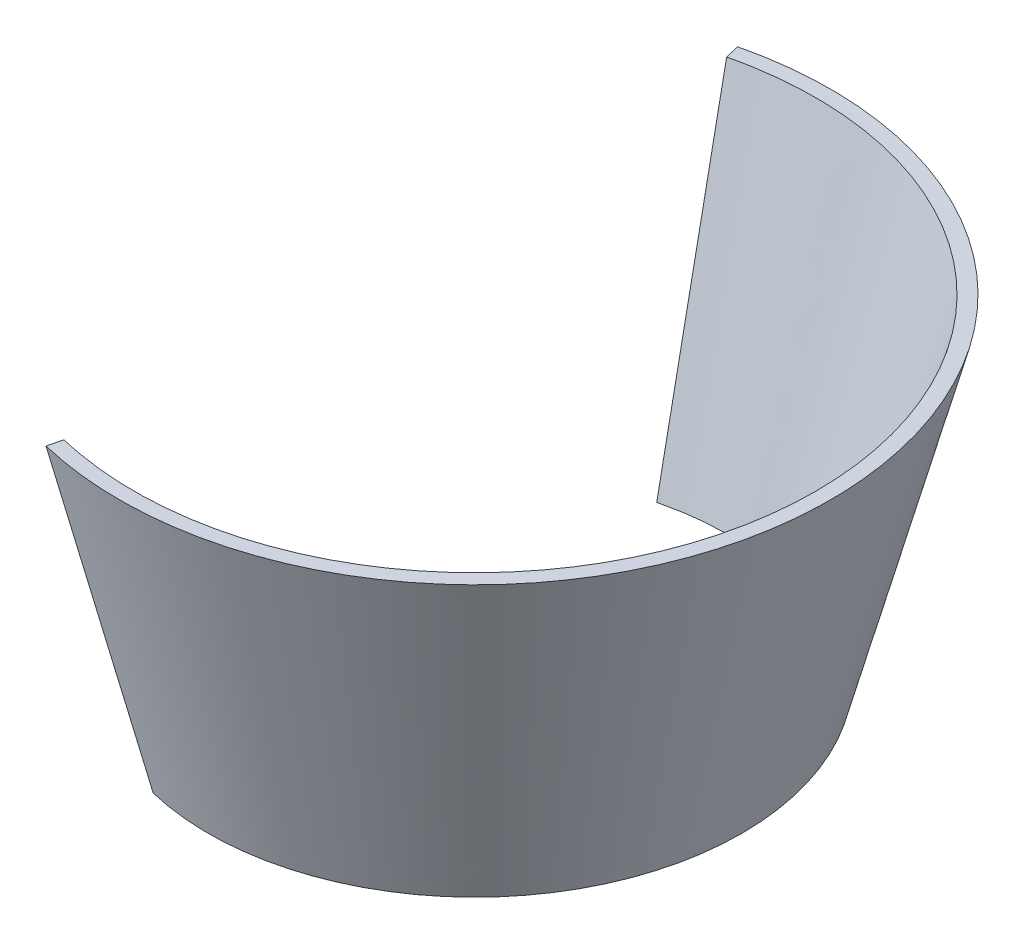
ISO-10303-21;
HEADER;
FILE_DESCRIPTION(('STEP AP214'),'2;1');
FILE_NAME('part.step','',(''),(''),'','','');
FILE_SCHEMA(('AUTOMOTIVE_DESIGN { 1 0 10303 214 1 1 1 1 }'));
ENDSEC;
DATA;
#1=APPLICATION_CONTEXT('core data for automotive mechanical design processes');
#2=APPLICATION_PROTOCOL_DEFINITION('international standard','automotive_design',2000,#1);
#3=PRODUCT_CONTEXT('',#1,'mechanical');
#4=PRODUCT('Part','Part','',(#3));
#5=PRODUCT_RELATED_PRODUCT_CATEGORY('part','',(#4));
#6=PRODUCT_DEFINITION_FORMATION('','',#4);
#7=PRODUCT_DEFINITION_CONTEXT('part definition',#1,'design');
#8=PRODUCT_DEFINITION('design','',#6,#7);
#9=PRODUCT_DEFINITION_SHAPE('','',#8);
#10=(LENGTH_UNIT() NAMED_UNIT(*) SI_UNIT(.MILLI.,.METRE.));
#11=(NAMED_UNIT(*) PLANE_ANGLE_UNIT() SI_UNIT($,.RADIAN.));
#12=(NAMED_UNIT(*) SI_UNIT($,.STERADIAN.) SOLID_ANGLE_UNIT());
#13=UNCERTAINTY_MEASURE_WITH_UNIT(LENGTH_MEASURE(1.E-05),#10,'distance_accuracy_value','');
#14=(GEOMETRIC_REPRESENTATION_CONTEXT(3) GLOBAL_UNCERTAINTY_ASSIGNED_CONTEXT((#13)) GLOBAL_UNIT_ASSIGNED_CONTEXT((#10,
#11,#12)) REPRESENTATION_CONTEXT('',''));
#15=CARTESIAN_POINT('',(0.,0.,0.));
#16=DIRECTION('',(0.,0.,1.));
#17=DIRECTION('',(1.,0.,0.));
#18=AXIS2_PLACEMENT_3D('',#15,#16,#17);
#19=CARTESIAN_POINT('',(26.2130748865882,45.,0.));
#20=DIRECTION('',(0.,1.,0.));
#21=DIRECTION('',(0.,0.,1.));
#22=AXIS2_PLACEMENT_3D('',#19,#20,#21);
#23=PLANE('',#22);
#24=CARTESIAN_POINT('',(26.2130748865882,45.,0.));
#25=DIRECTION('',(0.,1.,0.));
#26=DIRECTION('',(0.,0.,1.));
#27=AXIS2_PLACEMENT_3D('',#24,#25,#26);
#28=CIRCLE('',#27,48.);
#29=CARTESIAN_POINT('',(14.978208522353,45.,46.6666666666667));
#30=VERTEX_POINT('',#29);
#31=CARTESIAN_POINT('',(14.9782085223531,45.,-46.6666666666667));
#32=VERTEX_POINT('',#31);
#33=EDGE_CURVE('E307',#30,#32,#28,.T.);
#34=ORIENTED_EDGE('',*,*,#33,.T.);
#35=DIRECTION('',(0.234059715921564,0.,0.972222222222223));
#36=VECTOR('',#35,1.);
#37=CARTESIAN_POINT('',(15.4463279541962,45.,-44.7222222222222));
#38=LINE('',#37,#36);
#39=CARTESIAN_POINT('',(15.4463279541962,45.,-44.7222222222222));
#40=VERTEX_POINT('',#39);
#41=EDGE_CURVE('E345',#32,#40,#38,.T.);
#42=ORIENTED_EDGE('',*,*,#41,.T.);
#43=CARTESIAN_POINT('',(26.2130748865882,45.,0.));
#44=DIRECTION('',(0.,-1.,0.));
#45=DIRECTION('',(0.,0.,1.));
#46=AXIS2_PLACEMENT_3D('',#43,#44,#45);
#47=CIRCLE('',#46,46.);
#48=CARTESIAN_POINT('',(15.4463279541962,45.,44.7222222222222));
#49=VERTEX_POINT('',#48);
#50=EDGE_CURVE('E161',#40,#49,#47,.T.);
#51=ORIENTED_EDGE('',*,*,#50,.T.);
#52=DIRECTION('',(-0.234059715921565,0.,0.972222222222222));
#53=VECTOR('',#52,1.);
#54=CARTESIAN_POINT('',(14.978208522353,45.,46.6666666666667));
#55=LINE('',#54,#53);
#56=EDGE_CURVE('E13',#49,#30,#55,.T.);
#57=ORIENTED_EDGE('',*,*,#56,.T.);
#58=EDGE_LOOP('',(#34,#42,#51,#57));
#59=FACE_BOUND('',#58,.T.);
#60=ADVANCED_FACE('F151',(#59),#23,.T.);
#61=CARTESIAN_POINT('',(26.2130748865882,0.,0.));
#62=DIRECTION('',(0.,1.,0.));
#63=DIRECTION('',(0.,0.,1.));
#64=AXIS2_PLACEMENT_3D('',#61,#62,#63);
#65=PLANE('',#64);
#66=CARTESIAN_POINT('',(26.2130748865882,0.,0.));
#67=DIRECTION('',(0.,1.,0.));
#68=DIRECTION('',(0.,0.,1.));
#69=AXIS2_PLACEMENT_3D('',#66,#67,#68);
#70=CIRCLE('',#69,36.);
#71=CARTESIAN_POINT('',(17.7869251134118,0.,35.));
#72=VERTEX_POINT('',#71);
#73=CARTESIAN_POINT('',(17.7869251134118,0.,-35.));
#74=VERTEX_POINT('',#73);
#75=EDGE_CURVE('E226',#72,#74,#70,.T.);
#76=ORIENTED_EDGE('',*,*,#75,.F.);
#77=DIRECTION('',(0.,0.,1.));
#78=VECTOR('',#77,1.);
#79=CARTESIAN_POINT('',(17.7869251134118,0.,35.));
#80=LINE('',#79,#78);
#81=CARTESIAN_POINT('',(17.7869251134118,0.,32.9428571428571));
#82=VERTEX_POINT('',#81);
#83=EDGE_CURVE('E232',#82,#72,#80,.T.);
#84=ORIENTED_EDGE('',*,*,#83,.F.);
#85=DIRECTION('',(-0.972222222222222,0.,-0.234059715921569));
#86=VECTOR('',#85,1.);
#87=CARTESIAN_POINT('',(18.255044545255,0.,33.0555555555556));
#88=LINE('',#87,#86);
#89=CARTESIAN_POINT('',(18.2550445452549,0.,33.0555555555556));
#90=VERTEX_POINT('',#89);
#91=EDGE_CURVE('E237',#90,#82,#88,.T.);
#92=ORIENTED_EDGE('',*,*,#91,.F.);
#93=CARTESIAN_POINT('',(26.2130748865882,0.,0.));
#94=DIRECTION('',(0.,-1.,0.));
#95=DIRECTION('',(0.,0.,1.));
#96=AXIS2_PLACEMENT_3D('',#93,#94,#95);
#97=CIRCLE('',#96,34.);
#98=CARTESIAN_POINT('',(18.255044545255,0.,-33.0555555555556));
#99=VERTEX_POINT('',#98);
#100=EDGE_CURVE('E210',#99,#90,#97,.T.);
#101=ORIENTED_EDGE('',*,*,#100,.F.);
#102=DIRECTION('',(0.972222222222226,0.,-0.234059715921549));
#103=VECTOR('',#102,1.);
#104=CARTESIAN_POINT('',(18.255044545255,0.,-33.0555555555556));
#105=LINE('',#104,#103);
#106=CARTESIAN_POINT('',(17.7869251134118,0.,-32.9428571428572));
#107=VERTEX_POINT('',#106);
#108=EDGE_CURVE('E201',#107,#99,#105,.T.);
#109=ORIENTED_EDGE('',*,*,#108,.F.);
#110=DIRECTION('',(0.,0.,1.));
#111=VECTOR('',#110,1.);
#112=CARTESIAN_POINT('',(17.7869251134118,0.,-32.9428571428572));
#113=LINE('',#112,#111);
#114=EDGE_CURVE('E206',#74,#107,#113,.T.);
#115=ORIENTED_EDGE('',*,*,#114,.F.);
#116=EDGE_LOOP('',(#76,#84,#92,#101,#109,#115));
#117=FACE_BOUND('',#116,.T.);
#118=ADVANCED_FACE('F205',(#117),#65,.F.);
#119=CARTESIAN_POINT('',(17.7869251134118,0.,35.));
#120=CARTESIAN_POINT('',(16.8506862497255,15.,38.8888888888889));
#121=CARTESIAN_POINT('',(15.9144473860393,30.,42.7777777777778));
#122=CARTESIAN_POINT('',(14.978208522353,45.,46.6666666666667));
#123=CARTESIAN_POINT('',(20.4331930740949,0.,35.6370814336193));
#124=CARTESIAN_POINT('',(19.7812200443416,15.,39.5944065079972));
#125=CARTESIAN_POINT('',(19.1292470145884,30.,43.5517315823751));
#126=CARTESIAN_POINT('',(18.4772739848351,45.,47.509056656753));
#127=CARTESIAN_POINT('',(25.8650341850031,0.,36.3073434104184));
#128=CARTESIAN_POINT('',(25.8009951086674,15.,40.3400230841756));
#129=CARTESIAN_POINT('',(25.7369560323318,30.,44.3727027579328));
#130=CARTESIAN_POINT('',(25.6729169559961,44.9999999999999,48.40538243169));
#131=CARTESIAN_POINT('',(34.0166451466117,0.,35.4594510222689));
#132=CARTESIAN_POINT('',(34.8486569384541,15.0000000000001,39.4066620473167));
#133=CARTESIAN_POINT('',(35.6806687302965,30.0000000000001,43.3538730723645));
#134=CARTESIAN_POINT('',(36.512680522139,45.0000000000002,47.3010840974123));
#135=CARTESIAN_POINT('',(41.7607016913342,0.,32.8099715229774));
#136=CARTESIAN_POINT('',(43.4550868743957,14.9999999999999,36.4714187426141));
#137=CARTESIAN_POINT('',(45.1494720574571,29.9999999999999,40.1328659622508));
#138=CARTESIAN_POINT('',(46.8438572405185,44.9999999999998,43.7943131818875));
#139=CARTESIAN_POINT('',(48.7087108034478,0.,28.4979865766534));
#140=CARTESIAN_POINT('',(51.1842284172741,15.0000000000001,31.6841146788741));
#141=CARTESIAN_POINT('',(53.6597460311003,30.0000000000001,34.8702427810947));
#142=CARTESIAN_POINT('',(56.1352636449266,45.0000000000002,38.0563708833153));
#143=CARTESIAN_POINT('',(54.5130134713977,0.,22.7440124593599));
#144=CARTESIAN_POINT('',(57.6445749314993,15.,25.28838815786));
#145=CARTESIAN_POINT('',(60.7761363916009,29.9999999999999,27.8327638563602));
#146=CARTESIAN_POINT('',(63.9076978517024,44.9999999999999,30.3771395548604));
#147=CARTESIAN_POINT('',(58.8828519067817,0.,15.8386051696977));
#148=CARTESIAN_POINT('',(62.5086688342452,15.,17.6087417962542));
#149=CARTESIAN_POINT('',(66.1344857617086,30.,19.3788784228106));
#150=CARTESIAN_POINT('',(69.760302689172,45.,21.1490150493671));
#151=CARTESIAN_POINT('',(61.5984915351359,0.,8.12875589718416));
#152=CARTESIAN_POINT('',(65.5301458182768,15.,9.03450084914826));
#153=CARTESIAN_POINT('',(69.4618001014176,30.,9.94024580111236));
#154=CARTESIAN_POINT('',(73.3934543845585,45.,10.8459907530765));
#155=CARTESIAN_POINT('',(62.2130748865882,0.,2.71057142539832));
#156=CARTESIAN_POINT('',(66.2130748865882,15.,3.01174602822036));
#157=CARTESIAN_POINT('',(70.2130748865882,30.,3.31292063104239));
#158=CARTESIAN_POINT('',(74.2130748865882,45.,3.61409523386442));
#159=CARTESIAN_POINT('',(62.2130748865882,0.,-2.71057142539832));
#160=CARTESIAN_POINT('',(66.2130748865882,15.,-3.01174602822035));
#161=CARTESIAN_POINT('',(70.2130748865882,30.,-3.31292063104238));
#162=CARTESIAN_POINT('',(74.2130748865882,45.,-3.61409523386442));
#163=CARTESIAN_POINT('',(61.5984915351359,0.,-8.12875589718417));
#164=CARTESIAN_POINT('',(65.5301458182768,15.,-9.03450084914827));
#165=CARTESIAN_POINT('',(69.4618001014176,30.,-9.94024580111237));
#166=CARTESIAN_POINT('',(73.3934543845585,45.0000000000001,-10.8459907530765));
#167=CARTESIAN_POINT('',(58.8828519067818,0.,-15.8386051696977));
#168=CARTESIAN_POINT('',(62.5086688342452,15.,-17.6087417962542));
#169=CARTESIAN_POINT('',(66.1344857617086,30.,-19.3788784228107));
#170=CARTESIAN_POINT('',(69.760302689172,45.,-21.1490150493671));
#171=CARTESIAN_POINT('',(54.5130134713977,0.,-22.7440124593598));
#172=CARTESIAN_POINT('',(57.6445749314993,15.,-25.28838815786));
#173=CARTESIAN_POINT('',(60.7761363916009,30.,-27.8327638563602));
#174=CARTESIAN_POINT('',(63.9076978517024,45.,-30.3771395548604));
#175=CARTESIAN_POINT('',(48.7087108034481,0.,-28.4979865766535));
#176=CARTESIAN_POINT('',(51.1842284172742,15.,-31.6841146788741));
#177=CARTESIAN_POINT('',(53.6597460311004,29.9999999999999,-34.8702427810947));
#178=CARTESIAN_POINT('',(56.1352636449266,44.9999999999999,-38.0563708833153));
#179=CARTESIAN_POINT('',(41.7607016913339,0.,-32.8099715229774));
#180=CARTESIAN_POINT('',(43.4550868743954,15.0000000000001,-36.4714187426141));
#181=CARTESIAN_POINT('',(45.1494720574569,30.0000000000001,-40.1328659622508));
#182=CARTESIAN_POINT('',(46.8438572405184,45.0000000000002,-43.7943131818875));
#183=CARTESIAN_POINT('',(34.016645146612,0.,-35.4594510222689));
#184=CARTESIAN_POINT('',(34.8486569384544,14.9999999999999,-39.4066620473167));
#185=CARTESIAN_POINT('',(35.6806687302968,29.9999999999999,-43.3538730723645));
#186=CARTESIAN_POINT('',(36.5126805221392,44.9999999999998,-47.3010840974123));
#187=CARTESIAN_POINT('',(25.865034185003,0.,-36.3073434104184));
#188=CARTESIAN_POINT('',(25.8009951086673,15.,-40.3400230841756));
#189=CARTESIAN_POINT('',(25.7369560323317,30.,-44.3727027579328));
#190=CARTESIAN_POINT('',(25.672916955996,45.0000000000001,-48.40538243169));
#191=CARTESIAN_POINT('',(20.4331930740949,0.,-35.6370814336193));
#192=CARTESIAN_POINT('',(19.7812200443417,15.,-39.5944065079972));
#193=CARTESIAN_POINT('',(19.1292470145884,30.,-43.5517315823751));
#194=CARTESIAN_POINT('',(18.4772739848351,45.,-47.509056656753));
#195=CARTESIAN_POINT('',(17.7869251134118,0.,-35.));
#196=CARTESIAN_POINT('',(16.8506862497256,15.,-38.8888888888889));
#197=CARTESIAN_POINT('',(15.9144473860393,30.,-42.7777777777778));
#198=CARTESIAN_POINT('',(14.9782085223531,45.,-46.6666666666667));
#199=B_SPLINE_SURFACE_WITH_KNOTS('',3,3,((#119,#120,#121,#122),(#123,#124,#125,#126),(#127,#128,
#129,#130),(#131,#132,#133,#134),(#135,#136,#137,#138),(#139,#140,#141,#142),(#143,#144,#145,
#146),(#147,#148,#149,#150),(#151,#152,#153,#154),(#155,#156,#157,#158),(#159,#160,#161,#162),
(#163,#164,#165,#166),(#167,#168,#169,#170),(#171,#172,#173,#174),(#175,#176,#177,#178),(#179,
#180,#181,#182),(#183,#184,#185,#186),(#187,#188,#189,#190),(#191,#192,#193,#194),(#195,#196,
#197,#198)),.UNSPECIFIED.,.F.,.F.,.F.,(4,1,1,1,1,1,1,1,2,1,1,1,1,1,1,1,4),(4,4),
(0.49556834923423,0.52709532740709,0.558622305579951,0.590149283752812,0.621676261925672,
0.653203240098533,0.684730218271394,0.716257196444254,0.747784174617115,0.779311152789976,
0.810838130962836,0.842365109135697,0.873892087308557,0.905419065481418,0.936946043654279,
0.968473021827139,1.),(0.,1.),.UNSPECIFIED.);
#200=CARTESIAN_POINT('',(17.7869251134118,0.,-35.));
#201=CARTESIAN_POINT('',(16.8506862497256,15.,-38.8888888888889));
#202=CARTESIAN_POINT('',(15.9144473860393,30.,-42.7777777777778));
#203=CARTESIAN_POINT('',(14.9782085223531,45.,-46.6666666666667));
#204=B_SPLINE_CURVE_WITH_KNOTS('',3,(#200,#201,#202,#203),.UNSPECIFIED.,.F.,.F.,(4,4),(0.,1.),.UNSPECIFIED.);
#205=EDGE_CURVE('E225',#74,#32,#204,.T.);
#206=CARTESIAN_POINT('',(17.7869251134118,0.,35.));
#207=CARTESIAN_POINT('',(16.8506862497255,15.,38.8888888888889));
#208=CARTESIAN_POINT('',(15.9144473860393,30.,42.7777777777778));
#209=CARTESIAN_POINT('',(14.978208522353,45.,46.6666666666667));
#210=B_SPLINE_CURVE_WITH_KNOTS('',3,(#206,#207,#208,#209),.UNSPECIFIED.,.F.,.F.,(4,4),(0.,1.),.UNSPECIFIED.);
#211=EDGE_CURVE('E234',#72,#30,#210,.T.);
#212=ORIENTED_EDGE('',*,*,#75,.T.);
#213=ORIENTED_EDGE('',*,*,#205,.T.);
#214=ORIENTED_EDGE('',*,*,#33,.F.);
#215=ORIENTED_EDGE('',*,*,#211,.F.);
#216=EDGE_LOOP('',(#212,#213,#214,#215));
#217=FACE_BOUND('',#216,.T.);
#218=ADVANCED_FACE('F312',(#217),#199,.T.);
#219=CARTESIAN_POINT('',(17.7869251134118,0.,32.9428571428571));
#220=CARTESIAN_POINT('',(17.0067260603399,15.,36.8693121693122));
#221=CARTESIAN_POINT('',(16.226527007268,30.,40.7957671957672));
#222=CARTESIAN_POINT('',(15.4463279541962,45.,44.7222222222222));
#223=CARTESIAN_POINT('',(17.7869251134118,0.,33.1142857142857));
#224=CARTESIAN_POINT('',(16.9937227427887,15.,37.0376102292769));
#225=CARTESIAN_POINT('',(16.2005203721657,30.,40.9609347442681));
#226=CARTESIAN_POINT('',(15.4073180015426,45.,44.8842592592593));
#227=CARTESIAN_POINT('',(17.7869251134118,0.,33.4571428571429));
#228=CARTESIAN_POINT('',(16.9677161076864,15.,37.3742063492064));
#229=CARTESIAN_POINT('',(16.1485071019609,30.0000000000001,41.2912698412699));
#230=CARTESIAN_POINT('',(15.3292980962354,45.0000000000001,45.2083333333334));
#231=CARTESIAN_POINT('',(17.7869251134118,0.,33.9714285714285));
#232=CARTESIAN_POINT('',(16.9287061550327,15.,37.8791005291005));
#233=CARTESIAN_POINT('',(16.0704871966536,29.9999999999999,41.7867724867724));
#234=CARTESIAN_POINT('',(15.2122682382746,44.9999999999999,45.6944444444444));
#235=CARTESIAN_POINT('',(17.7869251134118,0.,34.4857142857143));
#236=CARTESIAN_POINT('',(16.8896962023792,15.,38.3839947089947));
#237=CARTESIAN_POINT('',(15.9924672913465,30.,42.2822751322751));
#238=CARTESIAN_POINT('',(15.0952383803138,45.0000000000001,46.1805555555556));
#239=CARTESIAN_POINT('',(17.7869251134118,0.,34.8285714285714));
#240=CARTESIAN_POINT('',(16.8636895672768,15.,38.7205908289242));
#241=CARTESIAN_POINT('',(15.9404540211417,30.,42.6126102292769));
#242=CARTESIAN_POINT('',(15.0172184750066,45.,46.5046296296296));
#243=CARTESIAN_POINT('',(17.7869251134118,0.,35.));
#244=CARTESIAN_POINT('',(16.8506862497255,15.,38.8888888888889));
#245=CARTESIAN_POINT('',(15.9144473860393,30.,42.7777777777778));
#246=CARTESIAN_POINT('',(14.978208522353,45.,46.6666666666667));
#247=B_SPLINE_SURFACE_WITH_KNOTS('',3,3,((#219,#220,#221,#222),(#223,#224,#225,#226),(#227,#228,
#229,#230),(#231,#232,#233,#234),(#235,#236,#237,#238),(#239,#240,#241,#242),(#243,#244,#245,
#246)),.UNSPECIFIED.,.F.,.F.,.F.,(4,1,1,1,4),(4,4),(0.488673323218464,0.490397079722405,
0.492120836226347,0.493844592730288,0.49556834923423),(0.,1.),.UNSPECIFIED.);
#248=CARTESIAN_POINT('',(17.7869251134118,0.,32.9428571428571));
#249=CARTESIAN_POINT('',(17.0067260603399,15.,36.8693121693122));
#250=CARTESIAN_POINT('',(16.226527007268,30.,40.7957671957672));
#251=CARTESIAN_POINT('',(15.4463279541962,45.,44.7222222222222));
#252=B_SPLINE_CURVE_WITH_KNOTS('',3,(#248,#249,#250,#251),.UNSPECIFIED.,.F.,.F.,(4,4),(0.,1.),.UNSPECIFIED.);
#253=EDGE_CURVE('E169',#82,#49,#252,.T.);
#254=ORIENTED_EDGE('',*,*,#83,.T.);
#255=ORIENTED_EDGE('',*,*,#211,.T.);
#256=ORIENTED_EDGE('',*,*,#56,.F.);
#257=ORIENTED_EDGE('',*,*,#253,.F.);
#258=EDGE_LOOP('',(#254,#255,#256,#257));
#259=FACE_BOUND('',#258,.T.);
#260=ADVANCED_FACE('F265',(#259),#247,.T.);
#261=CARTESIAN_POINT('',(17.7869251134118,0.,-32.9428571428571));
#262=CARTESIAN_POINT('',(17.00672606034,15.,-36.8693121693122));
#263=CARTESIAN_POINT('',(16.2265270072681,30.,-40.7957671957672));
#264=CARTESIAN_POINT('',(15.4463279541962,45.,-44.7222222222222));
#265=CARTESIAN_POINT('',(17.844321171125,0.,-32.9566750793909));
#266=CARTESIAN_POINT('',(17.0690567890316,15.,-36.884318113753));
#267=CARTESIAN_POINT('',(16.2937924069383,30.,-40.811961148115));
#268=CARTESIAN_POINT('',(15.518528024845,45.,-44.7396041824771));
#269=CARTESIAN_POINT('',(17.9191392160667,0.,-32.9746873094599));
#270=CARTESIAN_POINT('',(17.172965257726,15.,-36.9092313949099));
#271=CARTESIAN_POINT('',(16.4267912993854,30.,-40.84377548036));
#272=CARTESIAN_POINT('',(15.6806173410448,45.,-44.77831956581));
#273=CARTESIAN_POINT('',(18.0222286622794,0.,-32.9995057984262));
#274=CARTESIAN_POINT('',(17.354352288882,15.,-36.9518879632082));
#275=CARTESIAN_POINT('',(16.6864759154846,30.,-40.9042701279902));
#276=CARTESIAN_POINT('',(16.0185995420871,44.9999999999999,-44.8566522927722));
#277=CARTESIAN_POINT('',(18.1244507290917,0.,-33.0241154682858));
#278=CARTESIAN_POINT('',(17.5383816825623,15.,-36.9941106613306));
#279=CARTESIAN_POINT('',(16.9523126360328,30.0000000000001,-40.9641058543753));
#280=CARTESIAN_POINT('',(16.3662435895034,45.0000000000001,-44.9341010474201));
#281=CARTESIAN_POINT('',(18.1993695345363,0.,-33.0421519561573));
#282=CARTESIAN_POINT('',(17.6446326942419,15.,-37.0182603540947));
#283=CARTESIAN_POINT('',(17.0898958539475,30.,-40.994368752032));
#284=CARTESIAN_POINT('',(16.5351590136531,45.,-44.9704771499694));
#285=CARTESIAN_POINT('',(20.7397517410092,0.,-33.6537416976674));
#286=CARTESIAN_POINT('',(20.4779141773658,15.,-37.6692701194291));
#287=CARTESIAN_POINT('',(20.2160766137224,30.,-41.6847985411908));
#288=CARTESIAN_POINT('',(19.9542390500789,45.,-45.7003269629526));
#289=CARTESIAN_POINT('',(25.8461204162653,0.,-34.2879404256693));
#290=CARTESIAN_POINT('',(26.1640951728946,15.,-38.3182863247147));
#291=CARTESIAN_POINT('',(26.4820699295239,30.,-42.34863222376));
#292=CARTESIAN_POINT('',(26.8000446861533,45.,-46.3789781228053));
#293=CARTESIAN_POINT('',(33.528669537866,0.,-33.5006794673219));
#294=CARTESIAN_POINT('',(34.6971993045908,15.,-37.3678349201799));
#295=CARTESIAN_POINT('',(35.8657290713155,30.,-41.2349903730378));
#296=CARTESIAN_POINT('',(37.0342588380403,45.,-45.1021458258958));
#297=CARTESIAN_POINT('',(40.8435107249492,0.,-31.0126220206275));
#298=CARTESIAN_POINT('',(42.8052842513913,15.,-34.5410342906244));
#299=CARTESIAN_POINT('',(44.7670577778335,30.,-38.0694465606213));
#300=CARTESIAN_POINT('',(46.7288313042757,45.0000000000001,-41.5978588306182));
#301=CARTESIAN_POINT('',(47.4180488604718,0.,-26.9480088120864));
#302=CARTESIAN_POINT('',(50.0809757610789,15.,-29.9791035260715));
#303=CARTESIAN_POINT('',(52.7439026616859,30.,-33.0101982400566));
#304=CARTESIAN_POINT('',(55.406829562293,44.9999999999999,-36.0412929540417));
#305=CARTESIAN_POINT('',(52.9166824036968,0.,-21.5121862884483));
#306=CARTESIAN_POINT('',(56.1583902532594,15.,-23.9109652714076));
#307=CARTESIAN_POINT('',(59.4000981028219,30.,-26.3097442543669));
#308=CARTESIAN_POINT('',(62.6418059523845,45.,-28.7085232373263));
#309=CARTESIAN_POINT('',(57.0584767307628,0.,-14.9808894337757));
#310=CARTESIAN_POINT('',(60.7319252252126,15.,-16.6412203255765));
#311=CARTESIAN_POINT('',(64.4053737196625,30.,-18.3015512173773));
#312=CARTESIAN_POINT('',(68.0788222141123,45.0000000000001,-19.9618821091782));
#313=CARTESIAN_POINT('',(59.6314598983773,0.,-7.68633689094628));
#314=CARTESIAN_POINT('',(63.5714220086092,15.,-8.53512477693396));
#315=CARTESIAN_POINT('',(67.5113841188411,29.9999999999999,-9.38391266292164));
#316=CARTESIAN_POINT('',(71.451346229073,44.9999999999999,-10.2327005489093));
#317=CARTESIAN_POINT('',(60.5040624137008,0.,0.));
#318=CARTESIAN_POINT('',(64.5340993544708,15.0000000000001,0.));
#319=CARTESIAN_POINT('',(68.5641362952409,30.0000000000001,0.));
#320=CARTESIAN_POINT('',(72.5941732360109,45.0000000000002,0.));
#321=CARTESIAN_POINT('',(59.6314598983773,0.,7.68633689094624));
#322=CARTESIAN_POINT('',(63.5714220086093,14.9999999999999,8.53512477693395));
#323=CARTESIAN_POINT('',(67.5113841188413,29.9999999999999,9.38391266292165));
#324=CARTESIAN_POINT('',(71.4513462290733,44.9999999999998,10.2327005489094));
#325=CARTESIAN_POINT('',(57.0584767307627,0.,14.9808894337756));
#326=CARTESIAN_POINT('',(60.7319252252124,15.0000000000001,16.6412203255765));
#327=CARTESIAN_POINT('',(64.4053737196621,30.0000000000001,18.3015512173774));
#328=CARTESIAN_POINT('',(68.0788222141117,45.0000000000002,19.9618821091783));
#329=CARTESIAN_POINT('',(52.9166824036967,0.,21.5121862884483));
#330=CARTESIAN_POINT('',(56.1583902532594,14.9999999999999,23.9109652714077));
#331=CARTESIAN_POINT('',(59.4000981028221,29.9999999999999,26.309744254367));
#332=CARTESIAN_POINT('',(62.6418059523848,44.9999999999998,28.7085232373263));
#333=CARTESIAN_POINT('',(47.4180488604719,0.,26.9480088120863));
#334=CARTESIAN_POINT('',(50.0809757610788,15.0000000000001,29.9791035260715));
#335=CARTESIAN_POINT('',(52.7439026616857,30.0000000000002,33.0101982400567));
#336=CARTESIAN_POINT('',(55.4068295622925,45.0000000000002,36.0412929540419));
#337=CARTESIAN_POINT('',(40.843510724949,0.,31.0126220206276));
#338=CARTESIAN_POINT('',(42.8052842513912,14.9999999999999,34.5410342906245));
#339=CARTESIAN_POINT('',(44.7670577778335,29.9999999999998,38.0694465606214));
#340=CARTESIAN_POINT('',(46.7288313042757,44.9999999999997,41.5978588306182));
#341=CARTESIAN_POINT('',(33.5286695378663,0.,33.5006794673219));
#342=CARTESIAN_POINT('',(34.6971993045908,15.,37.3678349201799));
#343=CARTESIAN_POINT('',(35.8657290713154,30.0000000000001,41.2349903730379));
#344=CARTESIAN_POINT('',(37.0342588380399,45.0000000000001,45.102145825896));
#345=CARTESIAN_POINT('',(25.846120416265,0.,34.2879404256693));
#346=CARTESIAN_POINT('',(26.1640951728945,15.,38.3182863247146));
#347=CARTESIAN_POINT('',(26.4820699295239,30.,42.3486322237599));
#348=CARTESIAN_POINT('',(26.8000446861533,45.,46.3789781228052));
#349=CARTESIAN_POINT('',(20.7397517410092,0.,33.6537416976674));
#350=CARTESIAN_POINT('',(20.4779141773657,15.,37.6692701194291));
#351=CARTESIAN_POINT('',(20.2160766137223,30.,41.6847985411908));
#352=CARTESIAN_POINT('',(19.9542390500788,45.,45.7003269629526));
#353=CARTESIAN_POINT('',(18.1993695345362,0.,33.0421519561573));
#354=CARTESIAN_POINT('',(17.6446326942418,15.,37.0182603540947));
#355=CARTESIAN_POINT('',(17.0898958539474,30.,40.994368752032));
#356=CARTESIAN_POINT('',(16.535159013653,45.,44.9704771499694));
#357=CARTESIAN_POINT('',(18.1244507290917,0.,33.0241154682858));
#358=CARTESIAN_POINT('',(17.5383816825622,15.,36.9941106613305));
#359=CARTESIAN_POINT('',(16.9523126360328,30.,40.9641058543753));
#360=CARTESIAN_POINT('',(16.3662435895033,45.,44.93410104742));
#361=CARTESIAN_POINT('',(18.0222286622794,0.,32.9995057984262));
#362=CARTESIAN_POINT('',(17.3543522888819,15.,36.9518879632082));
#363=CARTESIAN_POINT('',(16.6864759154844,30.,40.9042701279902));
#364=CARTESIAN_POINT('',(16.0185995420869,45.,44.8566522927722));
#365=CARTESIAN_POINT('',(17.9191392160666,0.,32.9746873094599));
#366=CARTESIAN_POINT('',(17.172965257726,15.,36.9092313949099));
#367=CARTESIAN_POINT('',(16.4267912993854,30.,40.84377548036));
#368=CARTESIAN_POINT('',(15.6806173410448,45.,44.77831956581));
#369=CARTESIAN_POINT('',(17.844321171125,0.,32.9566750793909));
#370=CARTESIAN_POINT('',(17.0690567890316,15.,36.884318113753));
#371=CARTESIAN_POINT('',(16.2937924069383,30.,40.811961148115));
#372=CARTESIAN_POINT('',(15.5185280248449,45.,44.7396041824771));
#373=CARTESIAN_POINT('',(17.7869251134118,0.,32.9428571428571));
#374=CARTESIAN_POINT('',(17.0067260603399,15.,36.8693121693122));
#375=CARTESIAN_POINT('',(16.226527007268,30.,40.7957671957672));
#376=CARTESIAN_POINT('',(15.4463279541962,45.,44.7222222222222));
#377=B_SPLINE_SURFACE_WITH_KNOTS('',3,3,((#261,#262,#263,#264),(#265,#266,#267,#268),(#269,#270,
#271,#272),(#273,#274,#275,#276),(#277,#278,#279,#280),(#281,#282,#283,#284),(#285,#286,#287,
#288),(#289,#290,#291,#292),(#293,#294,#295,#296),(#297,#298,#299,#300),(#301,#302,#303,#304),
(#305,#306,#307,#308),(#309,#310,#311,#312),(#313,#314,#315,#316),(#317,#318,#319,#320),(#321,
#322,#323,#324),(#325,#326,#327,#328),(#329,#330,#331,#332),(#333,#334,#335,#336),(#337,#338,
#339,#340),(#341,#342,#343,#344),(#345,#346,#347,#348),(#349,#350,#351,#352),(#353,#354,#355,
#356),(#357,#358,#359,#360),(#361,#362,#363,#364),(#365,#366,#367,#368),(#369,#370,#371,#372),
(#373,#374,#375,#376)),.UNSPECIFIED.,.F.,.F.,.F.,(4,1,1,1,2,1,1,1,1,1,1,1,1,1,1,1,1,1,1,1,2,1,1,
1,4),(4,4),(0.00689502601576575,0.00756225324171711,0.00822948046766853,0.00889670769361994,
0.0095639349195713,0.0393414648817643,0.0691189948439573,0.0988965248061502,0.128674054768343,
0.158451584730536,0.188229114692729,0.218006644654922,0.247784174617115,0.277561704579308,
0.307339234541501,0.337116764503694,0.366894294465887,0.39667182442808,0.426449354390273,
0.456226884352466,0.486004414314659,0.48667164154061,0.487338868766561,0.488006095992513,
0.488673323218464),(0.,1.),.UNSPECIFIED.);
#378=CARTESIAN_POINT('',(17.7869251134118,0.,-32.9428571428571));
#379=CARTESIAN_POINT('',(17.00672606034,15.,-36.8693121693122));
#380=CARTESIAN_POINT('',(16.2265270072681,30.,-40.7957671957672));
#381=CARTESIAN_POINT('',(15.4463279541962,45.,-44.7222222222222));
#382=B_SPLINE_CURVE_WITH_KNOTS('',3,(#378,#379,#380,#381),.UNSPECIFIED.,.F.,.F.,(4,4),(0.,1.),.UNSPECIFIED.);
#383=EDGE_CURVE('E222',#107,#40,#382,.T.);
#384=ORIENTED_EDGE('',*,*,#108,.T.);
#385=ORIENTED_EDGE('',*,*,#100,.T.);
#386=ORIENTED_EDGE('',*,*,#91,.T.);
#387=ORIENTED_EDGE('',*,*,#253,.T.);
#388=ORIENTED_EDGE('',*,*,#50,.F.);
#389=ORIENTED_EDGE('',*,*,#383,.F.);
#390=EDGE_LOOP('',(#384,#385,#386,#387,#388,#389));
#391=FACE_BOUND('',#390,.T.);
#392=ADVANCED_FACE('F230',(#391),#377,.T.);
#393=CARTESIAN_POINT('',(17.7869251134118,0.,-35.));
#394=CARTESIAN_POINT('',(16.8506862497256,15.,-38.8888888888889));
#395=CARTESIAN_POINT('',(15.9144473860393,30.,-42.7777777777778));
#396=CARTESIAN_POINT('',(14.9782085223531,45.,-46.6666666666667));
#397=CARTESIAN_POINT('',(17.7869251134118,0.,-34.8285714285714));
#398=CARTESIAN_POINT('',(16.8636895672768,15.,-38.7205908289242));
#399=CARTESIAN_POINT('',(15.9404540211417,30.,-42.6126102292769));
#400=CARTESIAN_POINT('',(15.0172184750067,45.,-46.5046296296296));
#401=CARTESIAN_POINT('',(17.7869251134118,0.,-34.4857142857143));
#402=CARTESIAN_POINT('',(16.8896962023792,15.,-38.3839947089947));
#403=CARTESIAN_POINT('',(15.9924672913465,30.,-42.2822751322751));
#404=CARTESIAN_POINT('',(15.0952383803139,45.,-46.1805555555556));
#405=CARTESIAN_POINT('',(17.7869251134119,0.,-33.9714285714285));
#406=CARTESIAN_POINT('',(16.9287061550328,15.,-37.8791005291005));
#407=CARTESIAN_POINT('',(16.0704871966537,30.,-41.7867724867725));
#408=CARTESIAN_POINT('',(15.2122682382747,45.,-45.6944444444445));
#409=CARTESIAN_POINT('',(17.7869251134118,0.,-33.4571428571429));
#410=CARTESIAN_POINT('',(16.9677161076864,15.,-37.3742063492064));
#411=CARTESIAN_POINT('',(16.1485071019609,30.,-41.2912698412699));
#412=CARTESIAN_POINT('',(15.3292980962355,45.,-45.2083333333333));
#413=CARTESIAN_POINT('',(17.7869251134118,0.,-33.1142857142857));
#414=CARTESIAN_POINT('',(16.9937227427888,15.,-37.0376102292769));
#415=CARTESIAN_POINT('',(16.2005203721657,30.,-40.9609347442681));
#416=CARTESIAN_POINT('',(15.4073180015426,45.,-44.8842592592593));
#417=CARTESIAN_POINT('',(17.7869251134118,0.,-32.9428571428571));
#418=CARTESIAN_POINT('',(17.00672606034,15.,-36.8693121693122));
#419=CARTESIAN_POINT('',(16.2265270072681,30.,-40.7957671957672));
#420=CARTESIAN_POINT('',(15.4463279541962,45.,-44.7222222222222));
#421=B_SPLINE_SURFACE_WITH_KNOTS('',3,3,((#393,#394,#395,#396),(#397,#398,#399,#400),(#401,#402,
#403,#404),(#405,#406,#407,#408),(#409,#410,#411,#412),(#413,#414,#415,#416),(#417,#418,#419,
#420)),.UNSPECIFIED.,.F.,.F.,.F.,(4,1,1,1,4),(4,4),(0.,0.00172375650394141,0.00344751300788287,
0.00517126951182434,0.00689502601576575),(0.,1.),.UNSPECIFIED.);
#422=ORIENTED_EDGE('',*,*,#114,.T.);
#423=ORIENTED_EDGE('',*,*,#383,.T.);
#424=ORIENTED_EDGE('',*,*,#41,.F.);
#425=ORIENTED_EDGE('',*,*,#205,.F.);
#426=EDGE_LOOP('',(#422,#423,#424,#425));
#427=FACE_BOUND('',#426,.T.);
#428=ADVANCED_FACE('F221',(#427),#421,.T.);
#429=CLOSED_SHELL('',(#60,#118,#218,#260,#392,#428));
#430=MANIFOLD_SOLID_BREP('B2',#429);
#431=ADVANCED_BREP_SHAPE_REPRESENTATION('',(#18,#430),#14);
#432=SHAPE_DEFINITION_REPRESENTATION(#9,#431);
ENDSEC;
END-ISO-10303-21;
